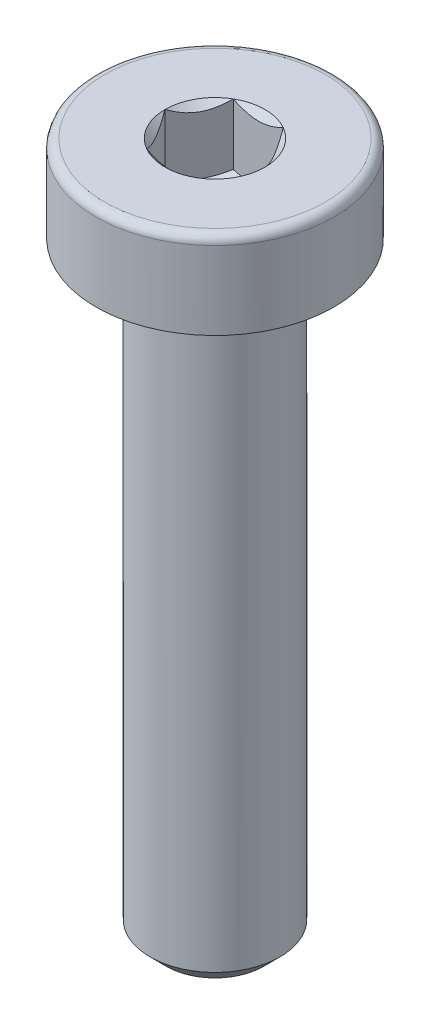
ISO-10303-21;
HEADER;
FILE_DESCRIPTION(('STEP AP214'),'2;1');
FILE_NAME('part.step','',(''),(''),'','','');
FILE_SCHEMA(('AUTOMOTIVE_DESIGN { 1 0 10303 214 1 1 1 1 }'));
ENDSEC;
DATA;
#1=APPLICATION_CONTEXT('core data for automotive mechanical design processes');
#2=APPLICATION_PROTOCOL_DEFINITION('international standard','automotive_design',2000,#1);
#3=PRODUCT_CONTEXT('',#1,'mechanical');
#4=PRODUCT('Part','Part','',(#3));
#5=PRODUCT_RELATED_PRODUCT_CATEGORY('part','',(#4));
#6=PRODUCT_DEFINITION_FORMATION('','',#4);
#7=PRODUCT_DEFINITION_CONTEXT('part definition',#1,'design');
#8=PRODUCT_DEFINITION('design','',#6,#7);
#9=PRODUCT_DEFINITION_SHAPE('','',#8);
#10=(LENGTH_UNIT() NAMED_UNIT(*) SI_UNIT(.MILLI.,.METRE.));
#11=(NAMED_UNIT(*) PLANE_ANGLE_UNIT() SI_UNIT($,.RADIAN.));
#12=(NAMED_UNIT(*) SI_UNIT($,.STERADIAN.) SOLID_ANGLE_UNIT());
#13=UNCERTAINTY_MEASURE_WITH_UNIT(LENGTH_MEASURE(1.E-05),#10,'distance_accuracy_value','');
#14=(GEOMETRIC_REPRESENTATION_CONTEXT(3) GLOBAL_UNCERTAINTY_ASSIGNED_CONTEXT((#13)) GLOBAL_UNIT_ASSIGNED_CONTEXT((#10,
#11,#12)) REPRESENTATION_CONTEXT('',''));
#15=CARTESIAN_POINT('',(0.,0.,0.));
#16=DIRECTION('',(0.,0.,1.));
#17=DIRECTION('',(1.,0.,0.));
#18=AXIS2_PLACEMENT_3D('',#15,#16,#17);
#19=CARTESIAN_POINT('',(0.,-0.2,0.));
#20=DIRECTION('',(0.,1.,0.));
#21=DIRECTION('',(0.,0.,-1.));
#22=AXIS2_PLACEMENT_3D('',#19,#20,#21);
#23=TOROIDAL_SURFACE('',#22,1.7,0.2);
#24=CARTESIAN_POINT('',(0.,0.,0.));
#25=DIRECTION('',(0.,-1.,0.));
#26=DIRECTION('',(0.,0.,-1.));
#27=AXIS2_PLACEMENT_3D('',#24,#25,#26);
#28=CIRCLE('',#27,1.7);
#29=CARTESIAN_POINT('',(0.,0.,-1.7));
#30=VERTEX_POINT('',#29);
#31=EDGE_CURVE('E151',#30,#30,#28,.T.);
#32=ORIENTED_EDGE('',*,*,#31,.T.);
#33=EDGE_LOOP('',(#32));
#34=FACE_BOUND('',#33,.T.);
#35=CARTESIAN_POINT('',(0.,-0.2,0.));
#36=DIRECTION('',(0.,1.,0.));
#37=DIRECTION('',(0.,0.,-1.));
#38=AXIS2_PLACEMENT_3D('',#35,#36,#37);
#39=CIRCLE('',#38,1.5);
#40=CARTESIAN_POINT('',(0.,-0.2,-1.5));
#41=VERTEX_POINT('',#40);
#42=EDGE_CURVE('E353',#41,#41,#39,.T.);
#43=ORIENTED_EDGE('',*,*,#42,.T.);
#44=EDGE_LOOP('',(#43));
#45=FACE_BOUND('',#44,.T.);
#46=ADVANCED_FACE('F41',(#34,#45),#23,.F.);
#47=CARTESIAN_POINT('',(0.,-14.,0.));
#48=DIRECTION('',(0.,1.,0.));
#49=DIRECTION('',(1.,0.,0.));
#50=AXIS2_PLACEMENT_3D('',#47,#48,#49);
#51=PLANE('',#50);
#52=CARTESIAN_POINT('',(0.,-14.,0.));
#53=DIRECTION('',(0.,1.,0.));
#54=DIRECTION('',(0.,0.,-1.));
#55=AXIS2_PLACEMENT_3D('',#52,#53,#54);
#56=CIRCLE('',#55,1.125);
#57=CARTESIAN_POINT('',(0.,-14.,-1.125));
#58=VERTEX_POINT('',#57);
#59=EDGE_CURVE('E11',#58,#58,#56,.T.);
#60=ORIENTED_EDGE('',*,*,#59,.F.);
#61=EDGE_LOOP('',(#60));
#62=FACE_BOUND('',#61,.T.);
#63=ADVANCED_FACE('F259',(#62),#51,.F.);
#64=CARTESIAN_POINT('',(0.,-14.125,0.));
#65=DIRECTION('',(0.,1.,0.));
#66=DIRECTION('',(-1.,0.,0.));
#67=AXIS2_PLACEMENT_3D('',#64,#65,#66);
#68=CONICAL_SURFACE('',#67,1.,0.785398163397448);
#69=ORIENTED_EDGE('',*,*,#59,.T.);
#70=EDGE_LOOP('',(#69));
#71=FACE_BOUND('',#70,.T.);
#72=CARTESIAN_POINT('',(0.,-13.625,0.));
#73=DIRECTION('',(0.,1.,0.));
#74=DIRECTION('',(-1.,0.,0.));
#75=AXIS2_PLACEMENT_3D('',#72,#73,#74);
#76=CIRCLE('',#75,1.5);
#77=CARTESIAN_POINT('',(-1.5,-13.625,0.));
#78=VERTEX_POINT('',#77);
#79=EDGE_CURVE('E348',#78,#78,#76,.T.);
#80=ORIENTED_EDGE('',*,*,#79,.F.);
#81=EDGE_LOOP('',(#80));
#82=FACE_BOUND('',#81,.T.);
#83=ADVANCED_FACE('F257',(#71,#82),#68,.T.);
#84=CARTESIAN_POINT('',(-1.15470053837925,0.5,0.));
#85=DIRECTION('',(-0.866025403784439,0.,-0.5));
#86=DIRECTION('',(0.,1.,0.));
#87=AXIS2_PLACEMENT_3D('',#84,#85,#86);
#88=PLANE('',#87);
#89=CARTESIAN_POINT('',(-1.15470053837925,2.,0.));
#90=CARTESIAN_POINT('',(-1.13811290051949,1.98342266199646,-0.0287348170953944));
#91=CARTESIAN_POINT('',(-1.12123555069305,1.96760439479917,-0.0577616138982867));
#92=CARTESIAN_POINT('',(-1.09593470093621,1.94579754194468,-0.101183953998303));
#93=CARTESIAN_POINT('',(-1.08770744910027,1.93899563963594,-0.115289976780325));
#94=CARTESIAN_POINT('',(-1.07137905760404,1.92611876946348,-0.143289328742409));
#95=CARTESIAN_POINT('',(-1.06328091933733,1.92002869586461,-0.157177412131507));
#96=CARTESIAN_POINT('',(-1.04720018701061,1.90857633773861,-0.184787164277924));
#97=CARTESIAN_POINT('',(-1.03921987610035,1.90319950581573,-0.198504111998951));
#98=CARTESIAN_POINT('',(-1.02335869013404,1.89317259824657,-0.225819419170297));
#99=CARTESIAN_POINT('',(-1.01547945146266,1.88850921181502,-0.239413822772958));
#100=CARTESIAN_POINT('',(-0.999798885932428,1.87990783588392,-0.266532275213475));
#101=CARTESIAN_POINT('',(-0.991998636338617,1.87595850190746,-0.280053335251351));
#102=CARTESIAN_POINT('',(-0.976448412405247,1.86878294697385,-0.307073372510779));
#103=CARTESIAN_POINT('',(-0.968699070566479,1.86554812543175,-0.320570421372709));
#104=CARTESIAN_POINT('',(-0.953216804871379,1.85979880306902,-0.347590357134202));
#105=CARTESIAN_POINT('',(-0.945484180860458,1.85727916970106,-0.361112320660297));
#106=CARTESIAN_POINT('',(-0.929993904585942,1.85295579242638,-0.388228510454098));
#107=CARTESIAN_POINT('',(-0.922236308144873,1.85115096744245,-0.401822595841889));
#108=CARTESIAN_POINT('',(-0.90665050966111,1.8482557150365,-0.429129644754855));
#109=CARTESIAN_POINT('',(-0.898822146976691,1.84716860492423,-0.442842867527506));
#110=CARTESIAN_POINT('',(-0.883030995902152,1.8456940799998,-0.470425755688464));
#111=CARTESIAN_POINT('',(-0.875067667178854,1.84531431420474,-0.484295517782133));
#112=CARTESIAN_POINT('',(-0.858942744760318,1.84528887087763,-0.51231125005588));
#113=CARTESIAN_POINT('',(-0.85078050857397,1.84565882739202,-0.52645688326507));
#114=CARTESIAN_POINT('',(-0.834496812685205,1.847210942197,-0.554713266474792));
#115=CARTESIAN_POINT('',(-0.826375327173013,1.84839249628394,-0.56882403459356));
#116=CARTESIAN_POINT('',(-0.810129363846157,1.85155142789717,-0.597074648783628));
#117=CARTESIAN_POINT('',(-0.802005196148906,1.85353382402747,-0.61121410805965));
#118=CARTESIAN_POINT('',(-0.785713974285288,1.85829144566636,-0.639587165283902));
#119=CARTESIAN_POINT('',(-0.777547766927851,1.86107677968836,-0.653819546505297));
#120=CARTESIAN_POINT('',(-0.761124224940597,1.86743549154836,-0.682436198086551));
#121=CARTESIAN_POINT('',(-0.752868210738168,1.87102315380283,-0.696818032238172));
#122=CARTESIAN_POINT('',(-0.736207806345465,1.87897968869029,-0.725784259598186));
#123=CARTESIAN_POINT('',(-0.727804874211313,1.88336586622526,-0.740364713591029));
#124=CARTESIAN_POINT('',(-0.711592080268563,1.8924866846744,-0.768416307208119));
#125=CARTESIAN_POINT('',(-0.703778742074904,1.89718094197276,-0.781898624581838));
#126=CARTESIAN_POINT('',(-0.688135072813054,1.90717702575227,-0.808872655482011));
#127=CARTESIAN_POINT('',(-0.680305730171417,1.91248565807263,-0.822362416598757));
#128=CARTESIAN_POINT('',(-0.664615689697741,1.92370585705,-0.84938935749767));
#129=CARTESIAN_POINT('',(-0.656756414542127,1.92962555083964,-0.862923982797114));
#130=CARTESIAN_POINT('',(-0.64099605532617,1.94206708289181,-0.890075839755966));
#131=CARTESIAN_POINT('',(-0.633096875640915,1.94859801630983,-0.903689987556145));
#132=CARTESIAN_POINT('',(-0.609052537896968,1.96932150291984,-0.945159941867087));
#133=CARTESIAN_POINT('',(-0.593083085982219,1.98426742536512,-0.972744659363466));
#134=CARTESIAN_POINT('',(-0.577350269189265,1.9999999999997,-0.999999999999873));
#135=B_SPLINE_CURVE_WITH_KNOTS('',3,(#89,#90,#91,#92,#93,#94,#95,#96,#97,#98,#99,#100,#101,#102,
#103,#104,#105,#106,#107,#108,#109,#110,#111,#112,#113,#114,#115,#116,#117,#118,#119,#120,#121,
#122,#123,#124,#125,#126,#127,#128,#129,#130,#131,#132,#133,#134),.UNSPECIFIED.,.F.,.F.,(4,2,2,
2,2,2,2,2,2,2,2,2,2,2,2,2,2,2,2,2,2,2,4),(0.,0.111272550174337,0.164335445361573,
0.215899595557141,0.266155171285321,0.315312848542686,0.363603421261408,0.411276511431237,
0.458598287135888,0.505848217490368,0.553315037999811,0.601292236029578,0.650280199235592,
0.699231732228985,0.748494907961426,0.798407597789335,0.849291872516503,0.90144968589758,
0.950262743745297,0.999680464451618,1.0498706012499,1.10098683352,1.20653128166088),.UNSPECIFIED.);
#136=CARTESIAN_POINT('',(-1.15470053837925,2.,0.));
#137=VERTEX_POINT('',#136);
#138=CARTESIAN_POINT('',(-0.577350269189626,2.,-1.));
#139=VERTEX_POINT('',#138);
#140=EDGE_CURVE('E142',#137,#139,#135,.T.);
#141=ORIENTED_EDGE('',*,*,#140,.F.);
#142=DIRECTION('',(0.,1.,0.));
#143=VECTOR('',#142,1.);
#144=CARTESIAN_POINT('',(-1.15470053837925,0.5,0.));
#145=LINE('',#144,#143);
#146=CARTESIAN_POINT('',(-1.15470053837925,0.589316397477044,0.));
#147=VERTEX_POINT('',#146);
#148=EDGE_CURVE('E53',#147,#137,#145,.T.);
#149=ORIENTED_EDGE('',*,*,#148,.F.);
#150=CARTESIAN_POINT('',(-1.15470053837925,0.589316397477044,0.));
#151=CARTESIAN_POINT('',(-0.866025403784419,0.422649730810363,-0.500000000000031));
#152=CARTESIAN_POINT('',(-0.577350269189623,0.589316397477023,-1.));
#153=B_SPLINE_CURVE_WITH_KNOTS('',2,(#150,#151,#152),.UNSPECIFIED.,.F.,.F.,(3,3),(0.,1.),.UNSPECIFIED.);
#154=CARTESIAN_POINT('',(-0.577350269189626,0.589316397477042,-1.));
#155=VERTEX_POINT('',#154);
#156=EDGE_CURVE('E145',#147,#155,#153,.T.);
#157=ORIENTED_EDGE('',*,*,#156,.T.);
#158=DIRECTION('',(0.,1.,0.));
#159=VECTOR('',#158,1.);
#160=CARTESIAN_POINT('',(-0.577350269189626,0.5,-1.));
#161=LINE('',#160,#159);
#162=EDGE_CURVE('E130',#155,#139,#161,.T.);
#163=ORIENTED_EDGE('',*,*,#162,.T.);
#164=EDGE_LOOP('',(#141,#149,#157,#163));
#165=FACE_BOUND('',#164,.T.);
#166=ADVANCED_FACE('F140',(#165),#88,.F.);
#167=CARTESIAN_POINT('',(-0.577350269189624,0.5,1.));
#168=DIRECTION('',(-0.866025403784438,0.,0.5));
#169=DIRECTION('',(-0.5,0.,-0.866025403784438));
#170=AXIS2_PLACEMENT_3D('',#167,#168,#169);
#171=PLANE('',#170);
#172=CARTESIAN_POINT('',(-0.577350269189628,2.00000000000001,1.));
#173=CARTESIAN_POINT('',(-0.593941531837459,1.98342266199647,0.971267275676974));
#174=CARTESIAN_POINT('',(-0.61064080034603,1.96760439479918,0.942137663577272));
#175=CARTESIAN_POINT('',(-0.635595225085994,1.94579754194469,0.898515314900514));
#176=CARTESIAN_POINT('',(-0.643697773243615,1.93899563963595,0.884337294416245));
#177=CARTESIAN_POINT('',(-0.659781727584165,1.92611876946349,0.856196816596529));
#178=CARTESIAN_POINT('',(-0.667760091475645,1.92002869586462,0.842239581439652));
#179=CARTESIAN_POINT('',(-0.683630472063271,1.90857633773862,0.814508382660042));
#180=CARTESIAN_POINT('',(-0.691519541796937,1.90319950581574,0.800738756821153));
#181=CARTESIAN_POINT('',(-0.70724469873634,1.89317259824658,0.773344913254501));
#182=CARTESIAN_POINT('',(-0.715078178269854,1.88850921181503,0.759724090601278));
#183=CARTESIAN_POINT('',(-0.730723164229545,1.87990783588393,0.732585096286131));
#184=CARTESIAN_POINT('',(-0.738532620911535,1.87595850190747,0.719069351963093));
#185=CARTESIAN_POINT('',(-0.754157547622717,1.86878294697386,0.692092444372544));
#186=CARTESIAN_POINT('',(-0.761971663893885,1.86554812543175,0.678632793046597));
#187=CARTESIAN_POINT('',(-0.77763048182441,1.85979880306903,0.651714789765753));
#188=CARTESIAN_POINT('',(-0.785474533741595,1.85727916970106,0.638257159171334));
#189=CARTESIAN_POINT('',(-0.80121270481961,1.85295579242638,0.611284091509063));
#190=CARTESIAN_POINT('',(-0.809106729886117,1.85115096744246,0.597768773224894));
#191=CARTESIAN_POINT('',(-0.824962428705249,1.84825571503651,0.570617551343206));
#192=CARTESIAN_POINT('',(-0.83292424665191,1.84716860492424,0.556981379002135));
#193=CARTESIAN_POINT('',(-0.848916152971775,1.84569407999981,0.529514396936106));
#194=CARTESIAN_POINT('',(-0.856946054927689,1.84531431420475,0.515683070916208));
#195=CARTESIAN_POINT('',(-0.873145929573069,1.84528887087764,0.487710612330905));
#196=CARTESIAN_POINT('',(-0.881315289191631,1.84565882739203,0.47356909183732));
#197=CARTESIAN_POINT('',(-0.897644186925879,1.84721094219701,0.445338805925414));
#198=CARTESIAN_POINT('',(-0.90580372782753,1.84839249628395,0.431250009096055));
#199=CARTESIAN_POINT('',(-0.922146495725198,1.85155142789717,0.403055285051083));
#200=CARTESIAN_POINT('',(-0.930329542805383,1.85353382402748,0.388949819802669));
#201=CARTESIAN_POINT('',(-0.946755720212819,1.85829144566637,0.360654679197969));
#202=CARTESIAN_POINT('',(-0.954998220228186,1.86107677968837,0.346466345563147));
#203=CARTESIAN_POINT('',(-0.971569196475207,1.86743549154837,0.31793481519138));
#204=CARTESIAN_POINT('',(-0.979896223102333,1.87102315380284,0.303593980082215));
#205=CARTESIAN_POINT('',(-0.996651509651594,1.8789796886903,0.274682532960673));
#206=CARTESIAN_POINT('',(-1.00507708714105,1.88336586622527,0.260115153269712));
#207=CARTESIAN_POINT('',(-1.02126408285868,1.89248668467436,0.232048665040395));
#208=CARTESIAN_POINT('',(-1.02903344310931,1.89718094197267,0.218540956989525));
#209=CARTESIAN_POINT('',(-1.04457180448032,1.90717702575211,0.191506126550374));
#210=CARTESIAN_POINT('',(-1.05233960897755,1.91248565807245,0.177980836369454));
#211=CARTESIAN_POINT('',(-1.06790060614572,1.92370585704978,0.150879392283449));
#212=CARTESIAN_POINT('',(-1.07569229790793,1.92962555083941,0.137305747693652));
#213=CARTESIAN_POINT('',(-1.09132631618625,1.94206708289158,0.11008094776045));
#214=CARTESIAN_POINT('',(-1.09916692418947,1.94859801630961,0.0964329835838638));
#215=CARTESIAN_POINT('',(-1.12305878924465,1.9693215029197,0.0548749991248427));
#216=CARTESIAN_POINT('',(-1.13896312939544,1.98426742536505,0.0272526893338586));
#217=CARTESIAN_POINT('',(-1.15470053837896,1.99999999999971,-2.5048082669767E-13));
#218=B_SPLINE_CURVE_WITH_KNOTS('',3,(#172,#173,#174,#175,#176,#177,#178,#179,#180,#181,#182,
#183,#184,#185,#186,#187,#188,#189,#190,#191,#192,#193,#194,#195,#196,#197,#198,#199,#200,#201,
#202,#203,#204,#205,#206,#207,#208,#209,#210,#211,#212,#213,#214,#215,#216,#217),.UNSPECIFIED.,
.F.,.F.,(4,2,2,2,2,2,2,2,2,2,2,2,2,2,2,2,2,2,2,2,2,2,4),(0.,0.111272550174332,0.164335445361567,
0.215899595557133,0.266155171285313,0.315312848542677,0.3636034212614,0.411276511431228,
0.45859828713588,0.505848217490361,0.553315037999805,0.601292236029574,0.65028019923533,
0.699231732228569,0.748494907960958,0.798407597788917,0.849291872516234,0.901449685897562,
0.950262743745008,0.999680464451159,1.04987060124937,1.10098683351952,1.20653128166087),.UNSPECIFIED.);
#219=CARTESIAN_POINT('',(-0.577350269189625,2.,1.));
#220=VERTEX_POINT('',#219);
#221=EDGE_CURVE('E389',#220,#137,#218,.T.);
#222=ORIENTED_EDGE('',*,*,#221,.F.);
#223=DIRECTION('',(0.,1.,0.));
#224=VECTOR('',#223,1.);
#225=CARTESIAN_POINT('',(-0.577350269189625,0.5,1.));
#226=LINE('',#225,#224);
#227=CARTESIAN_POINT('',(-0.577350269189625,0.589316397477047,1.));
#228=VERTEX_POINT('',#227);
#229=EDGE_CURVE('E308',#228,#220,#226,.T.);
#230=ORIENTED_EDGE('',*,*,#229,.F.);
#231=CARTESIAN_POINT('',(-0.577350269189624,0.589316397477046,1.));
#232=CARTESIAN_POINT('',(-0.866025403784455,0.422649730810367,0.499999999999969));
#233=CARTESIAN_POINT('',(-1.15470053837925,0.589316397477025,0.));
#234=B_SPLINE_CURVE_WITH_KNOTS('',2,(#231,#232,#233),.UNSPECIFIED.,.F.,.F.,(3,3),(0.,1.),.UNSPECIFIED.);
#235=EDGE_CURVE('E346',#228,#147,#234,.T.);
#236=ORIENTED_EDGE('',*,*,#235,.T.);
#237=ORIENTED_EDGE('',*,*,#148,.T.);
#238=EDGE_LOOP('',(#222,#230,#236,#237));
#239=FACE_BOUND('',#238,.T.);
#240=ADVANCED_FACE('F256',(#239),#171,.F.);
#241=CARTESIAN_POINT('',(0.577350269189628,0.5,1.));
#242=DIRECTION('',(0.,0.,1.));
#243=DIRECTION('',(0.,-1.,0.));
#244=AXIS2_PLACEMENT_3D('',#241,#242,#243);
#245=PLANE('',#244);
#246=CARTESIAN_POINT('',(0.577350269189624,2.00000000000001,1.));
#247=CARTESIAN_POINT('',(0.553800025915533,1.98822603681754,0.999998167957607));
#248=CARTESIAN_POINT('',(0.53002319662689,1.97688905054343,1.00001417378921));
#249=CARTESIAN_POINT('',(0.482781582166339,1.9556075877741,1.00006888120379));
#250=CARTESIAN_POINT('',(0.459331734859619,1.94562984801314,1.00010682894213));
#251=CARTESIAN_POINT('',(0.412637184989049,1.92706153398431,1.00019267101419));
#252=CARTESIAN_POINT('',(0.389404800641485,1.91844018503403,1.00024026062339));
#253=CARTESIAN_POINT('',(0.343025384343104,1.90258770334269,1.00032811834732));
#254=CARTESIAN_POINT('',(0.319887287423713,1.89533063168831,1.0003685220543));
#255=CARTESIAN_POINT('',(0.28396905815587,1.88513189438625,1.00037952108944));
#256=CARTESIAN_POINT('',(0.271315561221434,1.88173971858613,1.00037366472534));
#257=CARTESIAN_POINT('',(0.246157653172697,1.87541237483904,1.00034209137255));
#258=CARTESIAN_POINT('',(0.233655177580738,1.87246955581885,1.00031676570706));
#259=CARTESIAN_POINT('',(0.208770103174207,1.86704337026022,1.00026027717205));
#260=CARTESIAN_POINT('',(0.196389006729885,1.86455313042386,1.0002292192388));
#261=CARTESIAN_POINT('',(0.171716988877537,1.86003037325887,1.00016856051116));
#262=CARTESIAN_POINT('',(0.159427126425281,1.85799209889465,1.00013894565578));
#263=CARTESIAN_POINT('',(0.134906807402543,1.85437228307887,1.00008682181391));
#264=CARTESIAN_POINT('',(0.122677002769373,1.85278634040735,1.00006424413959));
#265=CARTESIAN_POINT('',(0.0982452716357383,1.85006970506283,1.00002877386777));
#266=CARTESIAN_POINT('',(0.0860436599187247,1.84893619003586,1.00001582077837));
#267=CARTESIAN_POINT('',(0.0616361034369748,1.84712271030556,0.999999281194874));
#268=CARTESIAN_POINT('',(0.049430239160526,1.84644166498135,0.99999567232403));
#269=CARTESIAN_POINT('',(0.0249814925742225,1.84553156126019,0.999994826477444));
#270=CARTESIAN_POINT('',(0.0127385824285995,1.84530325235072,0.999997600051223));
#271=CARTESIAN_POINT('',(-0.0117699093089312,1.84529590976491,1.00000240436833));
#272=CARTESIAN_POINT('',(-0.0240354911326579,1.84551770421206,1.00000443373431));
#273=CARTESIAN_POINT('',(-0.0485276608234832,1.84641485939752,1.00001329857417));
#274=CARTESIAN_POINT('',(-0.0607542789969373,1.84708939120195,1.00002012526552));
#275=CARTESIAN_POINT('',(-0.0852014626157827,1.84889040013758,1.00004221085803));
#276=CARTESIAN_POINT('',(-0.0974219540555072,1.8500178795742,1.00005748848831));
#277=CARTESIAN_POINT('',(-0.121889608631145,1.8527228717761,1.00009680071916));
#278=CARTESIAN_POINT('',(-0.13413646702124,1.85430313264586,1.00012088904999));
#279=CARTESIAN_POINT('',(-0.158689106182079,1.85791203563793,1.00017544918413));
#280=CARTESIAN_POINT('',(-0.170994247777745,1.85994501185442,1.00020598253097));
#281=CARTESIAN_POINT('',(-0.195695079239052,1.864457628014,1.00026809188207));
#282=CARTESIAN_POINT('',(-0.208089724420771,1.86694296685528,1.00029967641919));
#283=CARTESIAN_POINT('',(-0.233000226311658,1.87235971612185,1.00035691387752));
#284=CARTESIAN_POINT('',(-0.24551459573445,1.87529795011875,1.00038245763407));
#285=CARTESIAN_POINT('',(-0.270694579941495,1.88161679535159,1.00041468917582));
#286=CARTESIAN_POINT('',(-0.283358271723342,1.88500502464959,1.00042099293427));
#287=CARTESIAN_POINT('',(-0.319355980941363,1.89520675220563,1.00040981931455));
#288=CARTESIAN_POINT('',(-0.342562828838121,1.9024735224621,1.00036742345573));
#289=CARTESIAN_POINT('',(-0.389067231423858,1.91834639861325,1.00027227006806));
#290=CARTESIAN_POINT('',(-0.412356054143943,1.92697788991275,1.00021930978689));
#291=CARTESIAN_POINT('',(-0.459150817788463,1.94556797492265,1.00012281198921));
#292=CARTESIAN_POINT('',(-0.482644619058579,1.95555692973842,1.00007957938085));
#293=CARTESIAN_POINT('',(-0.529961603825126,1.97686192522768,1.00001682251946));
#294=CARTESIAN_POINT('',(-0.553769993135023,1.98821092489576,0.999998129439885));
#295=CARTESIAN_POINT('',(-0.577350269189629,2.,0.99999999999999));
#296=B_SPLINE_CURVE_WITH_KNOTS('',3,(#246,#247,#248,#249,#250,#251,#252,#253,#254,#255,#256,
#257,#258,#259,#260,#261,#262,#263,#264,#265,#266,#267,#268,#269,#270,#271,#272,#273,#274,#275,
#276,#277,#278,#279,#280,#281,#282,#283,#284,#285,#286,#287,#288,#289,#290,#291,#292,#293,#294,
#295),.UNSPECIFIED.,.F.,.F.,(4,2,2,2,2,2,2,2,2,2,2,2,2,2,2,2,2,2,2,2,2,2,2,2,4),(0.,
0.0789945069839851,0.155423933765288,0.229735714121901,0.302447276968801,0.341742966594387,
0.380268841749468,0.418149076076723,0.455514857491566,0.492503591404803,0.52925783231042,
0.565923975475662,0.602650767505618,0.639445192650885,0.676172432608918,0.712981396109526,
0.75001867970216,0.787427074463517,0.825344251186806,0.863901683628061,0.903223842479998,
0.976140734734358,1.05062170245461,1.12718543062468,1.20628071173709),.UNSPECIFIED.);
#297=CARTESIAN_POINT('',(0.577350269189628,2.,1.));
#298=VERTEX_POINT('',#297);
#299=EDGE_CURVE('E402',#298,#220,#296,.T.);
#300=ORIENTED_EDGE('',*,*,#299,.F.);
#301=DIRECTION('',(0.,1.,0.));
#302=VECTOR('',#301,1.);
#303=CARTESIAN_POINT('',(0.577350269189628,0.5,1.));
#304=LINE('',#303,#302);
#305=CARTESIAN_POINT('',(0.577350269189628,0.589316397477047,1.));
#306=VERTEX_POINT('',#305);
#307=EDGE_CURVE('E306',#306,#298,#304,.T.);
#308=ORIENTED_EDGE('',*,*,#307,.F.);
#309=CARTESIAN_POINT('',(0.577350269189629,0.589316397477046,1.));
#310=CARTESIAN_POINT('',(0.,0.422649730810369,1.));
#311=CARTESIAN_POINT('',(-0.577350269189626,0.589316397477027,1.));
#312=B_SPLINE_CURVE_WITH_KNOTS('',2,(#309,#310,#311),.UNSPECIFIED.,.F.,.F.,(3,3),(0.,1.),.UNSPECIFIED.);
#313=EDGE_CURVE('E135',#306,#228,#312,.T.);
#314=ORIENTED_EDGE('',*,*,#313,.T.);
#315=ORIENTED_EDGE('',*,*,#229,.T.);
#316=EDGE_LOOP('',(#300,#308,#314,#315));
#317=FACE_BOUND('',#316,.T.);
#318=ADVANCED_FACE('F273',(#317),#245,.F.);
#319=CARTESIAN_POINT('',(1.15470053837925,0.5,0.));
#320=DIRECTION('',(0.866025403784439,0.,0.5));
#321=DIRECTION('',(0.,-1.,0.));
#322=AXIS2_PLACEMENT_3D('',#319,#320,#321);
#323=PLANE('',#322);
#324=CARTESIAN_POINT('',(1.15470053837925,2.,0.));
#325=CARTESIAN_POINT('',(1.13811290051954,1.98342266199651,0.0287348170953168));
#326=CARTESIAN_POINT('',(1.12123555069315,1.96760439479927,0.0577616138981319));
#327=CARTESIAN_POINT('',(1.0959347009364,1.94579754194485,0.101183953998051));
#328=CARTESIAN_POINT('',(1.08770744910049,1.93899563963613,0.11528997678005));
#329=CARTESIAN_POINT('',(1.0713790576043,1.9261187694637,0.1432893287421));
#330=CARTESIAN_POINT('',(1.06328091933761,1.92002869586484,0.157177412131185));
#331=CARTESIAN_POINT('',(1.04720018701092,1.90857633773886,0.184787164277586));
#332=CARTESIAN_POINT('',(1.03921987610068,1.90319950581599,0.198504111998609));
#333=CARTESIAN_POINT('',(1.02335869013438,1.89317259824684,0.225819419169955));
#334=CARTESIAN_POINT('',(1.01547945146302,1.8885092118153,0.239413822772619));
#335=CARTESIAN_POINT('',(0.999798885932792,1.87990783588419,0.26653227521315));
#336=CARTESIAN_POINT('',(0.991998636338982,1.87595850190773,0.280053335251036));
#337=CARTESIAN_POINT('',(0.976448412405607,1.86878294697411,0.307073372510489));
#338=CARTESIAN_POINT('',(0.968699070566833,1.865548125432,0.320570421372434));
#339=CARTESIAN_POINT('',(0.953216804871711,1.85979880306925,0.34759035713396));
#340=CARTESIAN_POINT('',(0.945484180860775,1.85727916970128,0.361112320660075));
#341=CARTESIAN_POINT('',(0.929993904586221,1.85295579242657,0.388228510453917));
#342=CARTESIAN_POINT('',(0.922236308145128,1.85115096744263,0.401822595841729));
#343=CARTESIAN_POINT('',(0.90665050966131,1.84825571503663,0.429129644754741));
#344=CARTESIAN_POINT('',(0.898822146976858,1.84716860492434,0.442842867527415));
#345=CARTESIAN_POINT('',(0.883030995902241,1.84569407999986,0.470425755688419));
#346=CARTESIAN_POINT('',(0.875067667178897,1.84531431420477,0.48429551778211));
#347=CARTESIAN_POINT('',(0.858942744760382,1.84528887087762,0.512311250055722));
#348=CARTESIAN_POINT('',(0.850780508574103,1.84565882739198,0.526456883264756));
#349=CARTESIAN_POINT('',(0.834496812685462,1.84721094219691,0.554713266474235));
#350=CARTESIAN_POINT('',(0.826375327173327,1.84839249628385,0.568824034592915));
#351=CARTESIAN_POINT('',(0.810129363846558,1.85155142789705,0.597074648782873));
#352=CARTESIAN_POINT('',(0.802005196149339,1.85353382402735,0.611214108058871));
#353=CARTESIAN_POINT('',(0.785713974285749,1.85829144566624,0.639587165283134));
#354=CARTESIAN_POINT('',(0.777547766928309,1.86107677968825,0.653819546504565));
#355=CARTESIAN_POINT('',(0.761124224941007,1.86743549154827,0.682436198085945));
#356=CARTESIAN_POINT('',(0.752868210738532,1.87102315380276,0.696818032237658));
#357=CARTESIAN_POINT('',(0.73620780634568,1.87897968869026,0.725784259597905));
#358=CARTESIAN_POINT('',(0.727804874211422,1.88336586622525,0.74036471359089));
#359=CARTESIAN_POINT('',(0.711592080268588,1.89248668467437,0.768416307208036));
#360=CARTESIAN_POINT('',(0.703778742074949,1.89718094197268,0.781898624581674));
#361=CARTESIAN_POINT('',(0.688135072813142,1.90717702575212,0.808872655481718));
#362=CARTESIAN_POINT('',(0.680305730171529,1.91248565807245,0.822362416598417));
#363=CARTESIAN_POINT('',(0.664615689697889,1.92370585704979,0.849389357497269));
#364=CARTESIAN_POINT('',(0.656756414542289,1.92962555083942,0.862923982796697));
#365=CARTESIAN_POINT('',(0.640996055326348,1.94206708289159,0.890075839755551));
#366=CARTESIAN_POINT('',(0.633096875641094,1.94859801630962,0.903689987555748));
#367=CARTESIAN_POINT('',(0.609052537897095,1.96932150291971,0.945159941866839));
#368=CARTESIAN_POINT('',(0.593083085982296,1.98426742536507,0.972744659363348));
#369=CARTESIAN_POINT('',(0.577350269189271,1.99999999999972,0.999999999999876));
#370=B_SPLINE_CURVE_WITH_KNOTS('',3,(#324,#325,#326,#327,#328,#329,#330,#331,#332,#333,#334,
#335,#336,#337,#338,#339,#340,#341,#342,#343,#344,#345,#346,#347,#348,#349,#350,#351,#352,#353,
#354,#355,#356,#357,#358,#359,#360,#361,#362,#363,#364,#365,#366,#367,#368,#369),.UNSPECIFIED.,
.F.,.F.,(4,2,2,2,2,2,2,2,2,2,2,2,2,2,2,2,2,2,2,2,2,2,4),(0.,0.111272550174011,0.16433544536114,
0.215899595556638,0.266155171284781,0.315312848542141,0.363603421260888,0.411276511430768,
0.458598287135496,0.505848217490074,0.553315037999631,0.601292236029526,0.650280199235029,
0.699231732228109,0.74849490796044,0.798407597788447,0.849291872515925,0.901449685897527,
0.950262743744969,0.999680464451117,1.04987060124933,1.10098683351948,1.20653128166083),.UNSPECIFIED.);
#371=CARTESIAN_POINT('',(1.15470053837925,2.,0.));
#372=VERTEX_POINT('',#371);
#373=EDGE_CURVE('E303',#372,#298,#370,.T.);
#374=ORIENTED_EDGE('',*,*,#373,.F.);
#375=DIRECTION('',(0.,1.,0.));
#376=VECTOR('',#375,1.);
#377=CARTESIAN_POINT('',(1.15470053837925,0.5,0.));
#378=LINE('',#377,#376);
#379=CARTESIAN_POINT('',(1.15470053837925,0.589316397477045,0.));
#380=VERTEX_POINT('',#379);
#381=EDGE_CURVE('E147',#380,#372,#378,.T.);
#382=ORIENTED_EDGE('',*,*,#381,.F.);
#383=CARTESIAN_POINT('',(1.15470053837925,0.589316397477044,0.));
#384=CARTESIAN_POINT('',(0.866025403784422,0.422649730810369,0.500000000000028));
#385=CARTESIAN_POINT('',(0.577350269189625,0.589316397477027,1.));
#386=B_SPLINE_CURVE_WITH_KNOTS('',2,(#383,#384,#385),.UNSPECIFIED.,.F.,.F.,(3,3),(0.,1.),.UNSPECIFIED.);
#387=EDGE_CURVE('E295',#380,#306,#386,.T.);
#388=ORIENTED_EDGE('',*,*,#387,.T.);
#389=ORIENTED_EDGE('',*,*,#307,.T.);
#390=EDGE_LOOP('',(#374,#382,#388,#389));
#391=FACE_BOUND('',#390,.T.);
#392=ADVANCED_FACE('F277',(#391),#323,.F.);
#393=CARTESIAN_POINT('',(0.577350269189626,0.5,-1.));
#394=DIRECTION('',(0.866025403784439,0.,-0.5));
#395=DIRECTION('',(0.,-1.,0.));
#396=AXIS2_PLACEMENT_3D('',#393,#394,#395);
#397=PLANE('',#396);
#398=CARTESIAN_POINT('',(0.577350269189624,1.99999999999999,-0.999999999999998));
#399=CARTESIAN_POINT('',(0.593941531837408,1.9834226619965,-0.971267275677055));
#400=CARTESIAN_POINT('',(0.610640800345942,1.96760439479926,-0.94213766357744));
#401=CARTESIAN_POINT('',(0.635595225085866,1.94579754194484,-0.898515314900803));
#402=CARTESIAN_POINT('',(0.64369777324348,1.93899563963612,-0.884337294416566));
#403=CARTESIAN_POINT('',(0.659781727584023,1.92611876946369,-0.856196816596903));
#404=CARTESIAN_POINT('',(0.667760091475502,1.92002869586483,-0.842239581440049));
#405=CARTESIAN_POINT('',(0.683630472063132,1.90857633773885,-0.814508382660476));
#406=CARTESIAN_POINT('',(0.691519541796802,1.90319950581598,-0.800738756821601));
#407=CARTESIAN_POINT('',(0.707244698736216,1.89317259824683,-0.773344913254968));
#408=CARTESIAN_POINT('',(0.715078178269738,1.88850921181529,-0.75972409060175));
#409=CARTESIAN_POINT('',(0.730723164229445,1.87990783588418,-0.732585096286604));
#410=CARTESIAN_POINT('',(0.738532620911444,1.87595850190772,-0.719069351963562));
#411=CARTESIAN_POINT('',(0.754157547622645,1.8687829469741,-0.692092444372996));
#412=CARTESIAN_POINT('',(0.761971663893822,1.86554812543199,-0.678632793047035));
#413=CARTESIAN_POINT('',(0.777630481824367,1.85979880306924,-0.651714789766157));
#414=CARTESIAN_POINT('',(0.785474533741561,1.85727916970127,-0.638257159171715));
#415=CARTESIAN_POINT('',(0.801212704819592,1.85295579242656,-0.611284091509391));
#416=CARTESIAN_POINT('',(0.809106729886106,1.85115096744262,-0.59776877322519));
#417=CARTESIAN_POINT('',(0.824962428705249,1.84825571503662,-0.570617551343432));
#418=CARTESIAN_POINT('',(0.832924246651914,1.84716860492433,-0.556981379002321));
#419=CARTESIAN_POINT('',(0.848916152971781,1.84569407999985,-0.529514396936204));
#420=CARTESIAN_POINT('',(0.856946054927693,1.84531431420477,-0.515683070916256));
#421=CARTESIAN_POINT('',(0.873145929573076,1.8452888708776,-0.487710612330836));
#422=CARTESIAN_POINT('',(0.881315289191643,1.84565882739196,-0.473569091837184));
#423=CARTESIAN_POINT('',(0.897644186925894,1.8472109421969,-0.445338805925169));
#424=CARTESIAN_POINT('',(0.905803727827543,1.84839249628383,-0.431250009095768));
#425=CARTESIAN_POINT('',(0.922146495725204,1.85155142789704,-0.403055285050741));
#426=CARTESIAN_POINT('',(0.930329542805384,1.85353382402733,-0.388949819802311));
#427=CARTESIAN_POINT('',(0.946755720212809,1.85829144566623,-0.360654679197609));
#428=CARTESIAN_POINT('',(0.954998220228171,1.86107677968823,-0.3464663455628));
#429=CARTESIAN_POINT('',(0.971569196475185,1.86743549154826,-0.317934815191085));
#430=CARTESIAN_POINT('',(0.979896223102309,1.87102315380274,-0.303593980081958));
#431=CARTESIAN_POINT('',(0.996651509651577,1.87897968869024,-0.274682532960527));
#432=CARTESIAN_POINT('',(1.00507708714105,1.88336586622524,-0.260115153269637));
#433=CARTESIAN_POINT('',(1.02126408285878,1.89248668467443,-0.232048665040293));
#434=CARTESIAN_POINT('',(1.02903344310952,1.89718094197282,-0.218540956989325));
#435=CARTESIAN_POINT('',(1.04457180448067,1.90717702575239,-0.191506126550005));
#436=CARTESIAN_POINT('',(1.05233960897795,1.91248565807276,-0.177980836369012));
#437=CARTESIAN_POINT('',(1.06790060614618,1.92370585705016,-0.150879392282903));
#438=CARTESIAN_POINT('',(1.0756922979084,1.9296255508398,-0.137305747693075));
#439=CARTESIAN_POINT('',(1.0913263161867,1.94206708289197,-0.110080947759855));
#440=CARTESIAN_POINT('',(1.0991669241899,1.94859801630999,-0.0964329835832811));
#441=CARTESIAN_POINT('',(1.12305878924491,1.96932150291994,-0.0548749991244581));
#442=CARTESIAN_POINT('',(1.13896312939556,1.98426742536517,-0.027252689333654));
#443=CARTESIAN_POINT('',(1.15470053837897,1.99999999999972,2.51310661974698E-13));
#444=B_SPLINE_CURVE_WITH_KNOTS('',3,(#398,#399,#400,#401,#402,#403,#404,#405,#406,#407,#408,
#409,#410,#411,#412,#413,#414,#415,#416,#417,#418,#419,#420,#421,#422,#423,#424,#425,#426,#427,
#428,#429,#430,#431,#432,#433,#434,#435,#436,#437,#438,#439,#440,#441,#442,#443),.UNSPECIFIED.,
.F.,.F.,(4,2,2,2,2,2,2,2,2,2,2,2,2,2,2,2,2,2,2,2,2,2,4),(0.,0.111272550174011,0.164335445361141,
0.215899595556638,0.266155171284782,0.315312848542142,0.363603421260889,0.411276511430769,
0.458598287135497,0.505848217490076,0.553315037999634,0.601292236029529,0.650280199235466,
0.699231732228805,0.748494907961222,0.798407597789143,0.849291872516367,0.901449685897551,
0.950262743745452,0.999680464451892,1.04987060125021,1.10098683352028,1.20653128166085),.UNSPECIFIED.);
#445=CARTESIAN_POINT('',(0.577350269189626,2.,-1.));
#446=VERTEX_POINT('',#445);
#447=EDGE_CURVE('E112',#446,#372,#444,.T.);
#448=ORIENTED_EDGE('',*,*,#447,.F.);
#449=DIRECTION('',(0.,1.,0.));
#450=VECTOR('',#449,1.);
#451=CARTESIAN_POINT('',(0.577350269189626,0.5,-1.));
#452=LINE('',#451,#450);
#453=CARTESIAN_POINT('',(0.577350269189626,0.589316397477042,-1.));
#454=VERTEX_POINT('',#453);
#455=EDGE_CURVE('E133',#454,#446,#452,.T.);
#456=ORIENTED_EDGE('',*,*,#455,.F.);
#457=CARTESIAN_POINT('',(0.577350269189626,0.589316397477041,-1.));
#458=CARTESIAN_POINT('',(0.866025403784456,0.422649730810364,-0.49999999999997));
#459=CARTESIAN_POINT('',(1.15470053837925,0.589316397477026,0.));
#460=B_SPLINE_CURVE_WITH_KNOTS('',2,(#457,#458,#459),.UNSPECIFIED.,.F.,.F.,(3,3),(0.,1.),.UNSPECIFIED.);
#461=EDGE_CURVE('E297',#454,#380,#460,.T.);
#462=ORIENTED_EDGE('',*,*,#461,.T.);
#463=ORIENTED_EDGE('',*,*,#381,.T.);
#464=EDGE_LOOP('',(#448,#456,#462,#463));
#465=FACE_BOUND('',#464,.T.);
#466=ADVANCED_FACE('F328',(#465),#397,.F.);
#467=CARTESIAN_POINT('',(-0.577350269189626,0.5,-1.));
#468=DIRECTION('',(0.,0.,-1.));
#469=DIRECTION('',(1.,0.,0.));
#470=AXIS2_PLACEMENT_3D('',#467,#468,#469);
#471=PLANE('',#470);
#472=CARTESIAN_POINT('',(-0.57735026918963,2.,-1.));
#473=CARTESIAN_POINT('',(-0.553799018626332,1.98822553857165,-0.999998173354036));
#474=CARTESIAN_POINT('',(-0.530021163519476,1.97688806823107,-1.00001416004713));
#475=CARTESIAN_POINT('',(-0.482777645672904,1.95560580828222,-1.00006882217097));
#476=CARTESIAN_POINT('',(-0.459326924867017,1.94562774621228,-1.00010674385478));
#477=CARTESIAN_POINT('',(-0.41263076310741,1.92705897163753,-1.00019256426333));
#478=CARTESIAN_POINT('',(-0.38939764378498,1.91843747465112,-1.00024015736838));
#479=CARTESIAN_POINT('',(-0.342950204797468,1.90256203937554,-1.00032813390887));
#480=CARTESIAN_POINT('',(-0.319743655589981,1.89528554551412,-1.00036863550711));
#481=CARTESIAN_POINT('',(-0.28379128714849,1.88508381221227,-1.0003795906038));
#482=CARTESIAN_POINT('',(-0.271173414160845,1.88170303933697,-1.00037378374481));
#483=CARTESIAN_POINT('',(-0.246085560922053,1.87539592858828,-1.00034249941035));
#484=CARTESIAN_POINT('',(-0.233617496928954,1.87246201269112,-1.00031740784827));
#485=CARTESIAN_POINT('',(-0.208764412875414,1.86704320231722,-1.00026132520407));
#486=CARTESIAN_POINT('',(-0.19638062679567,1.86455266223854,-1.00023042045424));
#487=CARTESIAN_POINT('',(-0.171702966320913,1.86002941476161,-1.00017003093781));
#488=CARTESIAN_POINT('',(-0.15941014937153,1.85799095773679,-1.00014053259975));
#489=CARTESIAN_POINT('',(-0.134883643999216,1.85437088523129,-1.00008857478594));
#490=CARTESIAN_POINT('',(-0.122650606079548,1.85278487744366,-1.00006604744148));
#491=CARTESIAN_POINT('',(-0.0982121229287101,1.85006821158009,-1.00003057238562));
#492=CARTESIAN_POINT('',(-0.0860069912288732,1.84893474144217,-1.00001756508196));
#493=CARTESIAN_POINT('',(-0.0615206333559041,1.84711617328081,-1.00000075780238));
#494=CARTESIAN_POINT('',(-0.0492392901357822,1.84643264686591,-0.999996989975494));
#495=CARTESIAN_POINT('',(-0.0246386324751404,1.84552292104013,-0.999995628044652));
#496=CARTESIAN_POINT('',(-0.012319289032145,1.84529750750861,-0.999998044533703));
#497=CARTESIAN_POINT('',(0.0121891761432831,1.84530155985422,-1.00000209957335));
#498=CARTESIAN_POINT('',(0.0243782990189907,1.845526246567,-1.00000374607075));
#499=CARTESIAN_POINT('',(0.0487185070377809,1.84642380416033,-1.00001205209129));
#500=CARTESIAN_POINT('',(0.0608696213382497,1.84709588263677,-1.00001870275395));
#501=CARTESIAN_POINT('',(0.0852380225508613,1.848891850074,-1.00004050720725));
#502=CARTESIAN_POINT('',(0.0974550405850347,1.85001938024755,-1.00005572992515));
#503=CARTESIAN_POINT('',(0.121916028787175,1.85272435329628,-1.00009503372606));
#504=CARTESIAN_POINT('',(0.13415969299641,1.85430455429515,-1.00011916938457));
#505=CARTESIAN_POINT('',(0.158706216430161,1.85791321080521,-1.00017388808731));
#506=CARTESIAN_POINT('',(0.171008435091418,1.85994600906713,-1.00020453345274));
#507=CARTESIAN_POINT('',(0.195703679393572,1.86445814400752,-1.00026690229582));
#508=CARTESIAN_POINT('',(0.20809565889068,1.86694318675753,-1.00029863477332));
#509=CARTESIAN_POINT('',(0.233038212021836,1.87236730255237,-1.00035626972392));
#510=CARTESIAN_POINT('',(0.24558702968548,1.8753144316261,-1.00038204351512));
#511=CARTESIAN_POINT('',(0.270837130755103,1.88165350290157,-1.00041455700835));
#512=CARTESIAN_POINT('',(0.283536471910628,1.88505313626283,-1.00042090732892));
#513=CARTESIAN_POINT('',(0.319499881149073,1.89525184723143,-1.00040967732382));
#514=CARTESIAN_POINT('',(0.342638089596974,1.90249917243223,-1.00036738779502));
#515=CARTESIAN_POINT('',(0.389074303524819,1.91834907543261,-1.00027237272484));
#516=CARTESIAN_POINT('',(0.412362412542345,1.92698042722443,-1.00021941755009));
#517=CARTESIAN_POINT('',(0.459155597441506,1.94557006531457,-1.00012289938572));
#518=CARTESIAN_POINT('',(0.482648537268387,1.95555870247411,-1.00007964036235));
#519=CARTESIAN_POINT('',(0.529963632723351,1.9768629062393,-1.00001683713881));
#520=CARTESIAN_POINT('',(0.553770998426698,1.9882114222119,-0.9999981241633));
#521=CARTESIAN_POINT('',(0.577350269189634,1.99999999999999,-0.99999999999999));
#522=B_SPLINE_CURVE_WITH_KNOTS('',3,(#472,#473,#474,#475,#476,#477,#478,#479,#480,#481,#482,
#483,#484,#485,#486,#487,#488,#489,#490,#491,#492,#493,#494,#495,#496,#497,#498,#499,#500,#501,
#502,#503,#504,#505,#506,#507,#508,#509,#510,#511,#512,#513,#514,#515,#516,#517,#518,#519,#520,
#521),.UNSPECIFIED.,.F.,.F.,(4,2,2,2,2,2,2,2,2,2,2,2,2,2,2,2,2,2,2,2,2,2,2,2,4),(0.,
0.0789978972695773,0.15543010410763,0.229744134366991,0.30266870017871,0.341852354194089,
0.380271674271243,0.418159989059979,0.45553460042943,0.492532973314776,0.529297720399875,
0.56619021112632,0.603145936609836,0.639711346045882,0.676212163855028,0.713010761266896,
0.750038523627865,0.787438183603003,0.825347352327571,0.86401143959863,0.903445706239183,
0.97614903621833,1.05062782272799,1.12718880955699,1.20628070690683),.UNSPECIFIED.);
#523=EDGE_CURVE('E107',#139,#446,#522,.T.);
#524=ORIENTED_EDGE('',*,*,#523,.F.);
#525=ORIENTED_EDGE('',*,*,#162,.F.);
#526=CARTESIAN_POINT('',(-0.577350269189627,0.589316397477041,-1.));
#527=CARTESIAN_POINT('',(0.,0.422649730810363,-1.));
#528=CARTESIAN_POINT('',(0.577350269189628,0.589316397477022,-1.));
#529=B_SPLINE_CURVE_WITH_KNOTS('',2,(#526,#527,#528),.UNSPECIFIED.,.F.,.F.,(3,3),(0.,1.),.UNSPECIFIED.);
#530=EDGE_CURVE('E345',#155,#454,#529,.T.);
#531=ORIENTED_EDGE('',*,*,#530,.T.);
#532=ORIENTED_EDGE('',*,*,#455,.T.);
#533=EDGE_LOOP('',(#524,#525,#531,#532));
#534=FACE_BOUND('',#533,.T.);
#535=ADVANCED_FACE('F129',(#534),#471,.F.);
#536=CARTESIAN_POINT('',(0.,2.,0.));
#537=DIRECTION('',(0.,1.,0.));
#538=DIRECTION('',(0.,0.,-1.));
#539=AXIS2_PLACEMENT_3D('',#536,#537,#538);
#540=CONICAL_SURFACE('',#539,1.15470053837925,0.785398163397448);
#541=ORIENTED_EDGE('',*,*,#140,.T.);
#542=CARTESIAN_POINT('',(0.,2.,0.));
#543=DIRECTION('',(0.,1.,0.));
#544=DIRECTION('',(-1.,0.,0.));
#545=AXIS2_PLACEMENT_3D('',#542,#543,#544);
#546=CIRCLE('',#545,1.15470053837925);
#547=EDGE_CURVE('E115',#139,#137,#546,.T.);
#548=ORIENTED_EDGE('',*,*,#547,.T.);
#549=EDGE_LOOP('',(#541,#548));
#550=FACE_BOUND('',#549,.T.);
#551=ADVANCED_FACE('F150',(#550),#540,.F.);
#552=CARTESIAN_POINT('',(0.,1.8,0.));
#553=DIRECTION('',(0.,1.,0.));
#554=DIRECTION('',(0.,0.,-1.));
#555=AXIS2_PLACEMENT_3D('',#552,#553,#554);
#556=TOROIDAL_SURFACE('',#555,2.55,0.2);
#557=CARTESIAN_POINT('',(0.,2.,0.));
#558=DIRECTION('',(0.,-1.,0.));
#559=DIRECTION('',(0.,0.,-1.));
#560=AXIS2_PLACEMENT_3D('',#557,#558,#559);
#561=CIRCLE('',#560,2.55);
#562=CARTESIAN_POINT('',(0.,2.,-2.55));
#563=VERTEX_POINT('',#562);
#564=EDGE_CURVE('E122',#563,#563,#561,.T.);
#565=ORIENTED_EDGE('',*,*,#564,.T.);
#566=EDGE_LOOP('',(#565));
#567=FACE_BOUND('',#566,.T.);
#568=CARTESIAN_POINT('',(0.,1.8,0.));
#569=DIRECTION('',(0.,1.,0.));
#570=DIRECTION('',(0.,0.,-1.));
#571=AXIS2_PLACEMENT_3D('',#568,#569,#570);
#572=CIRCLE('',#571,2.75);
#573=CARTESIAN_POINT('',(0.,1.8,-2.75));
#574=VERTEX_POINT('',#573);
#575=EDGE_CURVE('E361',#574,#574,#572,.T.);
#576=ORIENTED_EDGE('',*,*,#575,.T.);
#577=EDGE_LOOP('',(#576));
#578=FACE_BOUND('',#577,.T.);
#579=ADVANCED_FACE('F43',(#567,#578),#556,.T.);
#580=CARTESIAN_POINT('',(0.,0.,0.));
#581=DIRECTION('',(0.,1.,0.));
#582=DIRECTION('',(1.,0.,0.));
#583=AXIS2_PLACEMENT_3D('',#580,#581,#582);
#584=PLANE('',#583);
#585=CARTESIAN_POINT('',(0.,0.,0.));
#586=DIRECTION('',(0.,-1.,0.));
#587=DIRECTION('',(1.,0.,0.));
#588=AXIS2_PLACEMENT_3D('',#585,#586,#587);
#589=CIRCLE('',#588,2.75);
#590=CARTESIAN_POINT('',(2.75,0.,0.));
#591=VERTEX_POINT('',#590);
#592=EDGE_CURVE('E123',#591,#591,#589,.T.);
#593=ORIENTED_EDGE('',*,*,#592,.T.);
#594=EDGE_LOOP('',(#593));
#595=FACE_BOUND('',#594,.T.);
#596=ORIENTED_EDGE('',*,*,#31,.F.);
#597=EDGE_LOOP('',(#596));
#598=FACE_BOUND('',#597,.T.);
#599=ADVANCED_FACE('F279',(#595,#598),#584,.F.);
#600=CARTESIAN_POINT('',(0.,2.,0.));
#601=DIRECTION('',(0.,1.,0.));
#602=DIRECTION('',(1.,0.,0.));
#603=AXIS2_PLACEMENT_3D('',#600,#601,#602);
#604=PLANE('',#603);
#605=ORIENTED_EDGE('',*,*,#564,.F.);
#606=EDGE_LOOP('',(#605));
#607=FACE_BOUND('',#606,.T.);
#608=CARTESIAN_POINT('',(0.,2.,0.));
#609=DIRECTION('',(0.,1.,0.));
#610=DIRECTION('',(-1.,0.,0.));
#611=AXIS2_PLACEMENT_3D('',#608,#609,#610);
#612=CIRCLE('',#611,1.15470053837925);
#613=EDGE_CURVE('E118',#137,#220,#612,.T.);
#614=ORIENTED_EDGE('',*,*,#613,.F.);
#615=ORIENTED_EDGE('',*,*,#547,.F.);
#616=CARTESIAN_POINT('',(0.,2.,0.));
#617=DIRECTION('',(0.,1.,0.));
#618=DIRECTION('',(-1.,0.,0.));
#619=AXIS2_PLACEMENT_3D('',#616,#617,#618);
#620=CIRCLE('',#619,1.15470053837925);
#621=EDGE_CURVE('E103',#446,#139,#620,.T.);
#622=ORIENTED_EDGE('',*,*,#621,.F.);
#623=CARTESIAN_POINT('',(0.,2.,0.));
#624=DIRECTION('',(0.,1.,0.));
#625=DIRECTION('',(-1.,0.,0.));
#626=AXIS2_PLACEMENT_3D('',#623,#624,#625);
#627=CIRCLE('',#626,1.15470053837925);
#628=EDGE_CURVE('E318',#372,#446,#627,.T.);
#629=ORIENTED_EDGE('',*,*,#628,.F.);
#630=CARTESIAN_POINT('',(0.,2.,0.));
#631=DIRECTION('',(0.,1.,0.));
#632=DIRECTION('',(-1.,0.,0.));
#633=AXIS2_PLACEMENT_3D('',#630,#631,#632);
#634=CIRCLE('',#633,1.15470053837925);
#635=EDGE_CURVE('E406',#298,#372,#634,.T.);
#636=ORIENTED_EDGE('',*,*,#635,.F.);
#637=CARTESIAN_POINT('',(0.,2.,0.));
#638=DIRECTION('',(0.,1.,0.));
#639=DIRECTION('',(-1.,0.,0.));
#640=AXIS2_PLACEMENT_3D('',#637,#638,#639);
#641=CIRCLE('',#640,1.15470053837925);
#642=EDGE_CURVE('E399',#220,#298,#641,.T.);
#643=ORIENTED_EDGE('',*,*,#642,.F.);
#644=EDGE_LOOP('',(#614,#615,#622,#629,#636,#643));
#645=FACE_BOUND('',#644,.T.);
#646=ADVANCED_FACE('F116',(#607,#645),#604,.T.);
#647=CARTESIAN_POINT('',(0.,2.,0.));
#648=DIRECTION('',(0.,-1.,0.));
#649=DIRECTION('',(0.,0.,1.));
#650=AXIS2_PLACEMENT_3D('',#647,#648,#649);
#651=CYLINDRICAL_SURFACE('',#650,2.75);
#652=ORIENTED_EDGE('',*,*,#592,.F.);
#653=EDGE_LOOP('',(#652));
#654=FACE_BOUND('',#653,.T.);
#655=ORIENTED_EDGE('',*,*,#575,.F.);
#656=EDGE_LOOP('',(#655));
#657=FACE_BOUND('',#656,.T.);
#658=ADVANCED_FACE('F176',(#654,#657),#651,.T.);
#659=CARTESIAN_POINT('',(0.,2.,0.));
#660=DIRECTION('',(0.,1.,0.));
#661=DIRECTION('',(0.,0.,-1.));
#662=AXIS2_PLACEMENT_3D('',#659,#660,#661);
#663=CONICAL_SURFACE('',#662,1.15470053837925,0.785398163397448);
#664=ORIENTED_EDGE('',*,*,#221,.T.);
#665=ORIENTED_EDGE('',*,*,#613,.T.);
#666=EDGE_LOOP('',(#664,#665));
#667=FACE_BOUND('',#666,.T.);
#668=ADVANCED_FACE('F210',(#667),#663,.F.);
#669=CARTESIAN_POINT('',(0.,2.,0.));
#670=DIRECTION('',(0.,1.,0.));
#671=DIRECTION('',(0.,0.,-1.));
#672=AXIS2_PLACEMENT_3D('',#669,#670,#671);
#673=CONICAL_SURFACE('',#672,1.15470053837925,0.785398163397448);
#674=ORIENTED_EDGE('',*,*,#299,.T.);
#675=ORIENTED_EDGE('',*,*,#642,.T.);
#676=EDGE_LOOP('',(#674,#675));
#677=FACE_BOUND('',#676,.T.);
#678=ADVANCED_FACE('F460',(#677),#673,.F.);
#679=CARTESIAN_POINT('',(0.,2.,0.));
#680=DIRECTION('',(0.,1.,0.));
#681=DIRECTION('',(0.,0.,-1.));
#682=AXIS2_PLACEMENT_3D('',#679,#680,#681);
#683=CONICAL_SURFACE('',#682,1.15470053837925,0.785398163397448);
#684=ORIENTED_EDGE('',*,*,#373,.T.);
#685=ORIENTED_EDGE('',*,*,#635,.T.);
#686=EDGE_LOOP('',(#684,#685));
#687=FACE_BOUND('',#686,.T.);
#688=ADVANCED_FACE('F436',(#687),#683,.F.);
#689=CARTESIAN_POINT('',(0.,2.,0.));
#690=DIRECTION('',(0.,1.,0.));
#691=DIRECTION('',(0.,0.,-1.));
#692=AXIS2_PLACEMENT_3D('',#689,#690,#691);
#693=CONICAL_SURFACE('',#692,1.15470053837925,0.785398163397448);
#694=ORIENTED_EDGE('',*,*,#447,.T.);
#695=ORIENTED_EDGE('',*,*,#628,.T.);
#696=EDGE_LOOP('',(#694,#695));
#697=FACE_BOUND('',#696,.T.);
#698=ADVANCED_FACE('F175',(#697),#693,.F.);
#699=CARTESIAN_POINT('',(0.,2.,0.));
#700=DIRECTION('',(0.,1.,0.));
#701=DIRECTION('',(0.,0.,-1.));
#702=AXIS2_PLACEMENT_3D('',#699,#700,#701);
#703=CONICAL_SURFACE('',#702,1.15470053837925,0.785398163397448);
#704=ORIENTED_EDGE('',*,*,#523,.T.);
#705=ORIENTED_EDGE('',*,*,#621,.T.);
#706=EDGE_LOOP('',(#704,#705));
#707=FACE_BOUND('',#706,.T.);
#708=ADVANCED_FACE('F105',(#707),#703,.F.);
#709=CARTESIAN_POINT('',(0.,0.5,0.));
#710=DIRECTION('',(0.,1.,0.));
#711=DIRECTION('',(0.,0.,-1.));
#712=AXIS2_PLACEMENT_3D('',#709,#710,#711);
#713=CONICAL_SURFACE('',#712,1.,1.0471975511966);
#714=CARTESIAN_POINT('',(0.,-0.0773502691896258,0.));
#715=VERTEX_POINT('',#714);
#716=VERTEX_LOOP('',#715);
#717=FACE_BOUND('',#716,.T.);
#718=ORIENTED_EDGE('',*,*,#235,.F.);
#719=ORIENTED_EDGE('',*,*,#313,.F.);
#720=ORIENTED_EDGE('',*,*,#387,.F.);
#721=ORIENTED_EDGE('',*,*,#461,.F.);
#722=ORIENTED_EDGE('',*,*,#530,.F.);
#723=ORIENTED_EDGE('',*,*,#156,.F.);
#724=EDGE_LOOP('',(#718,#719,#720,#721,#722,#723));
#725=FACE_BOUND('',#724,.T.);
#726=ADVANCED_FACE('F174',(#717,#725),#713,.F.);
#727=CARTESIAN_POINT('',(0.,-14.,0.));
#728=DIRECTION('',(0.,1.,0.));
#729=DIRECTION('',(0.,0.,-1.));
#730=AXIS2_PLACEMENT_3D('',#727,#728,#729);
#731=CYLINDRICAL_SURFACE('',#730,1.5);
#732=ORIENTED_EDGE('',*,*,#79,.T.);
#733=EDGE_LOOP('',(#732));
#734=FACE_BOUND('',#733,.T.);
#735=ORIENTED_EDGE('',*,*,#42,.F.);
#736=EDGE_LOOP('',(#735));
#737=FACE_BOUND('',#736,.T.);
#738=ADVANCED_FACE('F207',(#734,#737),#731,.T.);
#739=CLOSED_SHELL('',(#46,#63,#83,#166,#240,#318,#392,#466,#535,#551,#579,#599,#646,#658,#668,
#678,#688,#698,#708,#726,#738));
#740=MANIFOLD_SOLID_BREP('B2',#739);
#741=ADVANCED_BREP_SHAPE_REPRESENTATION('',(#18,#740),#14);
#742=SHAPE_DEFINITION_REPRESENTATION(#9,#741);
ENDSEC;
END-ISO-10303-21;
